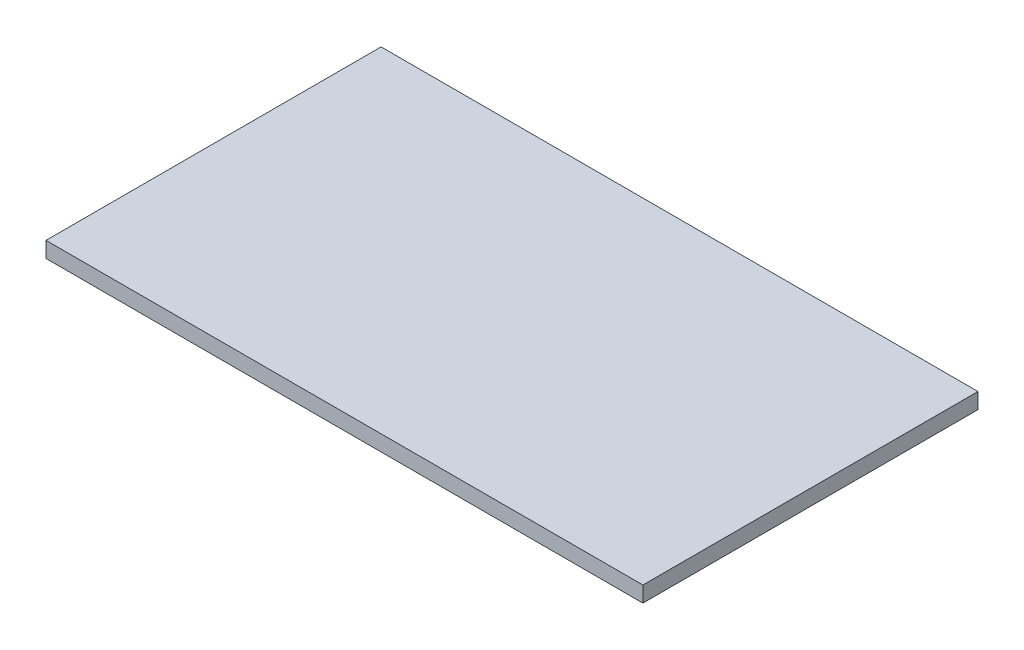
ISO-10303-21;
HEADER;
FILE_DESCRIPTION(('STEP AP214'),'2;1');
FILE_NAME('part.step','',(''),(''),'','','');
FILE_SCHEMA(('AUTOMOTIVE_DESIGN { 1 0 10303 214 1 1 1 1 }'));
ENDSEC;
DATA;
#1=APPLICATION_CONTEXT('core data for automotive mechanical design processes');
#2=APPLICATION_PROTOCOL_DEFINITION('international standard','automotive_design',2000,#1);
#3=PRODUCT_CONTEXT('',#1,'mechanical');
#4=PRODUCT('Part','Part','',(#3));
#5=PRODUCT_RELATED_PRODUCT_CATEGORY('part','',(#4));
#6=PRODUCT_DEFINITION_FORMATION('','',#4);
#7=PRODUCT_DEFINITION_CONTEXT('part definition',#1,'design');
#8=PRODUCT_DEFINITION('design','',#6,#7);
#9=PRODUCT_DEFINITION_SHAPE('','',#8);
#10=(LENGTH_UNIT() NAMED_UNIT(*) SI_UNIT(.MILLI.,.METRE.));
#11=(NAMED_UNIT(*) PLANE_ANGLE_UNIT() SI_UNIT($,.RADIAN.));
#12=(NAMED_UNIT(*) SI_UNIT($,.STERADIAN.) SOLID_ANGLE_UNIT());
#13=UNCERTAINTY_MEASURE_WITH_UNIT(LENGTH_MEASURE(1.E-05),#10,'distance_accuracy_value','');
#14=(GEOMETRIC_REPRESENTATION_CONTEXT(3) GLOBAL_UNCERTAINTY_ASSIGNED_CONTEXT((#13)) GLOBAL_UNIT_ASSIGNED_CONTEXT((#10,
#11,#12)) REPRESENTATION_CONTEXT('',''));
#15=CARTESIAN_POINT('',(0.,0.,0.));
#16=DIRECTION('',(0.,0.,1.));
#17=DIRECTION('',(1.,0.,0.));
#18=AXIS2_PLACEMENT_3D('',#15,#16,#17);
#19=CARTESIAN_POINT('',(28.5,1.5,-16.));
#20=DIRECTION('',(-1.,0.,0.));
#21=DIRECTION('',(0.,0.,1.));
#22=AXIS2_PLACEMENT_3D('',#19,#20,#21);
#23=PLANE('',#22);
#24=DIRECTION('',(0.,0.,-1.));
#25=VECTOR('',#24,1.);
#26=CARTESIAN_POINT('',(28.5,0.,-16.));
#27=LINE('',#26,#25);
#28=CARTESIAN_POINT('',(28.5,0.,16.));
#29=VERTEX_POINT('',#28);
#30=CARTESIAN_POINT('',(28.5,0.,-16.));
#31=VERTEX_POINT('',#30);
#32=EDGE_CURVE('E98',#29,#31,#27,.T.);
#33=ORIENTED_EDGE('',*,*,#32,.T.);
#34=DIRECTION('',(0.,-1.,0.));
#35=VECTOR('',#34,1.);
#36=CARTESIAN_POINT('',(28.5,1.5,-16.));
#37=LINE('',#36,#35);
#38=CARTESIAN_POINT('',(28.5,1.5,-16.));
#39=VERTEX_POINT('',#38);
#40=EDGE_CURVE('E11',#39,#31,#37,.T.);
#41=ORIENTED_EDGE('',*,*,#40,.F.);
#42=DIRECTION('',(0.,0.,-1.));
#43=VECTOR('',#42,1.);
#44=CARTESIAN_POINT('',(28.5,1.5,-16.));
#45=LINE('',#44,#43);
#46=CARTESIAN_POINT('',(28.5,1.5,16.));
#47=VERTEX_POINT('',#46);
#48=EDGE_CURVE('E86',#47,#39,#45,.T.);
#49=ORIENTED_EDGE('',*,*,#48,.F.);
#50=DIRECTION('',(0.,-1.,0.));
#51=VECTOR('',#50,1.);
#52=CARTESIAN_POINT('',(28.5,1.5,16.));
#53=LINE('',#52,#51);
#54=EDGE_CURVE('E94',#47,#29,#53,.T.);
#55=ORIENTED_EDGE('',*,*,#54,.T.);
#56=EDGE_LOOP('',(#33,#41,#49,#55));
#57=FACE_BOUND('',#56,.T.);
#58=ADVANCED_FACE('F35',(#57),#23,.F.);
#59=CARTESIAN_POINT('',(-28.5,1.5,-16.));
#60=DIRECTION('',(0.,0.,1.));
#61=DIRECTION('',(1.,0.,0.));
#62=AXIS2_PLACEMENT_3D('',#59,#60,#61);
#63=PLANE('',#62);
#64=DIRECTION('',(-1.,0.,0.));
#65=VECTOR('',#64,1.);
#66=CARTESIAN_POINT('',(-28.5,0.,-16.));
#67=LINE('',#66,#65);
#68=CARTESIAN_POINT('',(-28.5,0.,-16.));
#69=VERTEX_POINT('',#68);
#70=EDGE_CURVE('E90',#31,#69,#67,.T.);
#71=ORIENTED_EDGE('',*,*,#70,.T.);
#72=DIRECTION('',(0.,-1.,0.));
#73=VECTOR('',#72,1.);
#74=CARTESIAN_POINT('',(-28.5,1.5,-16.));
#75=LINE('',#74,#73);
#76=CARTESIAN_POINT('',(-28.5,1.5,-16.));
#77=VERTEX_POINT('',#76);
#78=EDGE_CURVE('E43',#77,#69,#75,.T.);
#79=ORIENTED_EDGE('',*,*,#78,.F.);
#80=DIRECTION('',(-1.,0.,0.));
#81=VECTOR('',#80,1.);
#82=CARTESIAN_POINT('',(-28.5,1.5,-16.));
#83=LINE('',#82,#81);
#84=EDGE_CURVE('E81',#39,#77,#83,.T.);
#85=ORIENTED_EDGE('',*,*,#84,.F.);
#86=ORIENTED_EDGE('',*,*,#40,.T.);
#87=EDGE_LOOP('',(#71,#79,#85,#86));
#88=FACE_BOUND('',#87,.T.);
#89=ADVANCED_FACE('F89',(#88),#63,.F.);
#90=CARTESIAN_POINT('',(-28.5,1.5,-16.));
#91=DIRECTION('',(1.,0.,0.));
#92=DIRECTION('',(0.,0.,-1.));
#93=AXIS2_PLACEMENT_3D('',#90,#91,#92);
#94=PLANE('',#93);
#95=DIRECTION('',(0.,0.,1.));
#96=VECTOR('',#95,1.);
#97=CARTESIAN_POINT('',(-28.5,0.,-16.));
#98=LINE('',#97,#96);
#99=CARTESIAN_POINT('',(-28.5,0.,16.));
#100=VERTEX_POINT('',#99);
#101=EDGE_CURVE('E68',#69,#100,#98,.T.);
#102=ORIENTED_EDGE('',*,*,#101,.T.);
#103=DIRECTION('',(0.,-1.,0.));
#104=VECTOR('',#103,1.);
#105=CARTESIAN_POINT('',(-28.5,1.5,16.));
#106=LINE('',#105,#104);
#107=CARTESIAN_POINT('',(-28.5,1.5,16.));
#108=VERTEX_POINT('',#107);
#109=EDGE_CURVE('E91',#108,#100,#106,.T.);
#110=ORIENTED_EDGE('',*,*,#109,.F.);
#111=DIRECTION('',(0.,0.,1.));
#112=VECTOR('',#111,1.);
#113=CARTESIAN_POINT('',(-28.5,1.5,-16.));
#114=LINE('',#113,#112);
#115=EDGE_CURVE('E84',#77,#108,#114,.T.);
#116=ORIENTED_EDGE('',*,*,#115,.F.);
#117=ORIENTED_EDGE('',*,*,#78,.T.);
#118=EDGE_LOOP('',(#102,#110,#116,#117));
#119=FACE_BOUND('',#118,.T.);
#120=ADVANCED_FACE('F92',(#119),#94,.F.);
#121=CARTESIAN_POINT('',(-28.5,1.5,16.));
#122=DIRECTION('',(0.,0.,-1.));
#123=DIRECTION('',(-1.,0.,0.));
#124=AXIS2_PLACEMENT_3D('',#121,#122,#123);
#125=PLANE('',#124);
#126=DIRECTION('',(1.,0.,0.));
#127=VECTOR('',#126,1.);
#128=CARTESIAN_POINT('',(-28.5,0.,16.));
#129=LINE('',#128,#127);
#130=EDGE_CURVE('E74',#100,#29,#129,.T.);
#131=ORIENTED_EDGE('',*,*,#130,.T.);
#132=ORIENTED_EDGE('',*,*,#54,.F.);
#133=DIRECTION('',(1.,0.,0.));
#134=VECTOR('',#133,1.);
#135=CARTESIAN_POINT('',(-28.5,1.5,16.));
#136=LINE('',#135,#134);
#137=EDGE_CURVE('E51',#108,#47,#136,.T.);
#138=ORIENTED_EDGE('',*,*,#137,.F.);
#139=ORIENTED_EDGE('',*,*,#109,.T.);
#140=EDGE_LOOP('',(#131,#132,#138,#139));
#141=FACE_BOUND('',#140,.T.);
#142=ADVANCED_FACE('F105',(#141),#125,.F.);
#143=CARTESIAN_POINT('',(0.,1.5,0.));
#144=DIRECTION('',(0.,1.,0.));
#145=DIRECTION('',(0.,0.,1.));
#146=AXIS2_PLACEMENT_3D('',#143,#144,#145);
#147=PLANE('',#146);
#148=ORIENTED_EDGE('',*,*,#48,.T.);
#149=ORIENTED_EDGE('',*,*,#84,.T.);
#150=ORIENTED_EDGE('',*,*,#115,.T.);
#151=ORIENTED_EDGE('',*,*,#137,.T.);
#152=EDGE_LOOP('',(#148,#149,#150,#151));
#153=FACE_BOUND('',#152,.T.);
#154=ADVANCED_FACE('F82',(#153),#147,.T.);
#155=CARTESIAN_POINT('',(0.,0.,0.));
#156=DIRECTION('',(0.,1.,0.));
#157=DIRECTION('',(0.,0.,1.));
#158=AXIS2_PLACEMENT_3D('',#155,#156,#157);
#159=PLANE('',#158);
#160=ORIENTED_EDGE('',*,*,#32,.F.);
#161=ORIENTED_EDGE('',*,*,#130,.F.);
#162=ORIENTED_EDGE('',*,*,#101,.F.);
#163=ORIENTED_EDGE('',*,*,#70,.F.);
#164=EDGE_LOOP('',(#160,#161,#162,#163));
#165=FACE_BOUND('',#164,.T.);
#166=ADVANCED_FACE('F108',(#165),#159,.F.);
#167=CLOSED_SHELL('',(#58,#89,#120,#142,#154,#166));
#168=MANIFOLD_SOLID_BREP('B2',#167);
#169=ADVANCED_BREP_SHAPE_REPRESENTATION('',(#18,#168),#14);
#170=SHAPE_DEFINITION_REPRESENTATION(#9,#169);
ENDSEC;
END-ISO-10303-21;
